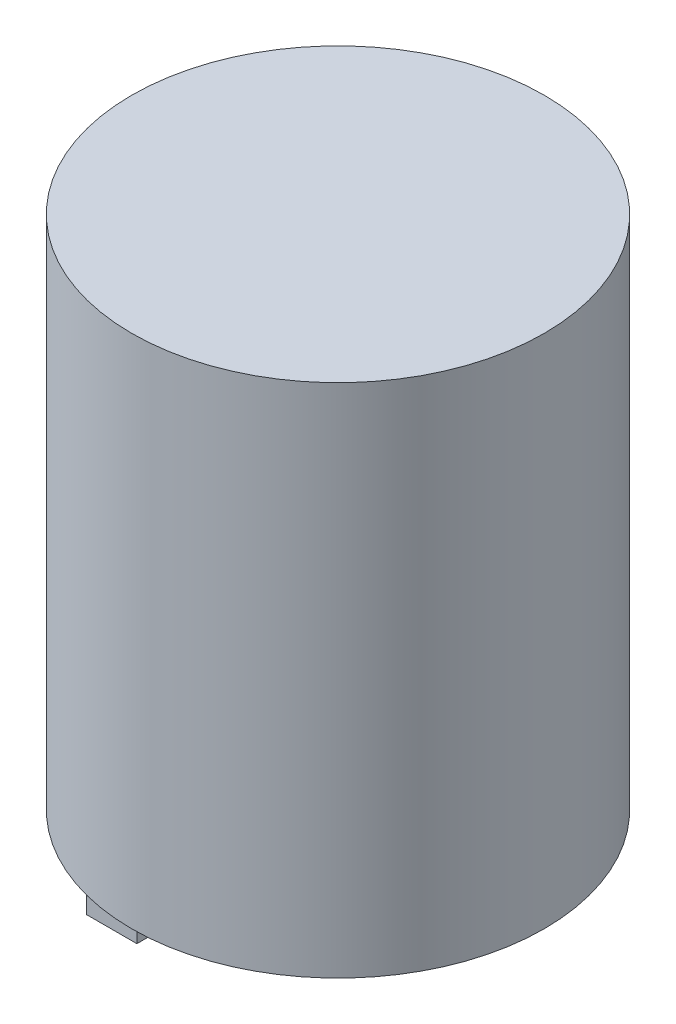
ISO-10303-21;
HEADER;
FILE_DESCRIPTION(('STEP AP214'),'2;1');
FILE_NAME('part.step','',(''),(''),'','','');
FILE_SCHEMA(('AUTOMOTIVE_DESIGN { 1 0 10303 214 1 1 1 1 }'));
ENDSEC;
DATA;
#1=APPLICATION_CONTEXT('core data for automotive mechanical design processes');
#2=APPLICATION_PROTOCOL_DEFINITION('international standard','automotive_design',2000,#1);
#3=PRODUCT_CONTEXT('',#1,'mechanical');
#4=PRODUCT('Part','Part','',(#3));
#5=PRODUCT_RELATED_PRODUCT_CATEGORY('part','',(#4));
#6=PRODUCT_DEFINITION_FORMATION('','',#4);
#7=PRODUCT_DEFINITION_CONTEXT('part definition',#1,'design');
#8=PRODUCT_DEFINITION('design','',#6,#7);
#9=PRODUCT_DEFINITION_SHAPE('','',#8);
#10=(LENGTH_UNIT() NAMED_UNIT(*) SI_UNIT(.MILLI.,.METRE.));
#11=(NAMED_UNIT(*) PLANE_ANGLE_UNIT() SI_UNIT($,.RADIAN.));
#12=(NAMED_UNIT(*) SI_UNIT($,.STERADIAN.) SOLID_ANGLE_UNIT());
#13=UNCERTAINTY_MEASURE_WITH_UNIT(LENGTH_MEASURE(1.E-05),#10,'distance_accuracy_value','');
#14=(GEOMETRIC_REPRESENTATION_CONTEXT(3) GLOBAL_UNCERTAINTY_ASSIGNED_CONTEXT((#13)) GLOBAL_UNIT_ASSIGNED_CONTEXT((#10,
#11,#12)) REPRESENTATION_CONTEXT('',''));
#15=CARTESIAN_POINT('',(0.,0.,0.));
#16=DIRECTION('',(0.,0.,1.));
#17=DIRECTION('',(1.,0.,0.));
#18=AXIS2_PLACEMENT_3D('',#15,#16,#17);
#19=CARTESIAN_POINT('',(-8.5,-8.,-2.5));
#20=DIRECTION('',(1.,0.,0.));
#21=DIRECTION('',(0.,0.,-1.));
#22=AXIS2_PLACEMENT_3D('',#19,#20,#21);
#23=PLANE('',#22);
#24=DIRECTION('',(0.,-1.,0.));
#25=VECTOR('',#24,1.);
#26=CARTESIAN_POINT('',(-8.5,-8.,1.5));
#27=LINE('',#26,#25);
#28=CARTESIAN_POINT('',(-8.5,-0.75,1.5));
#29=VERTEX_POINT('',#28);
#30=CARTESIAN_POINT('',(-8.5,-8.,1.5));
#31=VERTEX_POINT('',#30);
#32=EDGE_CURVE('E58',#29,#31,#27,.T.);
#33=ORIENTED_EDGE('',*,*,#32,.F.);
#34=DIRECTION('',(0.,0.,1.));
#35=VECTOR('',#34,1.);
#36=CARTESIAN_POINT('',(-8.5,-0.75,1.5));
#37=LINE('',#36,#35);
#38=CARTESIAN_POINT('',(-8.5,-0.75,-1.5));
#39=VERTEX_POINT('',#38);
#40=EDGE_CURVE('E171',#39,#29,#37,.T.);
#41=ORIENTED_EDGE('',*,*,#40,.F.);
#42=DIRECTION('',(0.,1.,0.));
#43=VECTOR('',#42,1.);
#44=CARTESIAN_POINT('',(-8.5,-0.75,-1.5));
#45=LINE('',#44,#43);
#46=CARTESIAN_POINT('',(-8.5,-8.,-1.5));
#47=VERTEX_POINT('',#46);
#48=EDGE_CURVE('E63',#47,#39,#45,.T.);
#49=ORIENTED_EDGE('',*,*,#48,.F.);
#50=DIRECTION('',(0.,0.,-1.));
#51=VECTOR('',#50,1.);
#52=CARTESIAN_POINT('',(-8.5,-8.,-2.5));
#53=LINE('',#52,#51);
#54=EDGE_CURVE('E129',#31,#47,#53,.T.);
#55=ORIENTED_EDGE('',*,*,#54,.F.);
#56=EDGE_LOOP('',(#33,#41,#49,#55));
#57=FACE_BOUND('',#56,.T.);
#58=ADVANCED_FACE('F44',(#57),#23,.F.);
#59=CARTESIAN_POINT('',(-8.5,-8.,-2.5));
#60=DIRECTION('',(0.,0.,1.));
#61=DIRECTION('',(1.,0.,0.));
#62=AXIS2_PLACEMENT_3D('',#59,#60,#61);
#63=PLANE('',#62);
#64=DIRECTION('',(1.,0.,0.));
#65=VECTOR('',#64,1.);
#66=CARTESIAN_POINT('',(-8.5,0.,-2.5));
#67=LINE('',#66,#65);
#68=CARTESIAN_POINT('',(-9.7,0.,-2.5));
#69=VERTEX_POINT('',#68);
#70=CARTESIAN_POINT('',(-7.25,0.,-2.5));
#71=VERTEX_POINT('',#70);
#72=EDGE_CURVE('E130',#69,#71,#67,.T.);
#73=ORIENTED_EDGE('',*,*,#72,.T.);
#74=DIRECTION('',(0.,1.,0.));
#75=VECTOR('',#74,1.);
#76=CARTESIAN_POINT('',(-7.25,-8.,-2.5));
#77=LINE('',#76,#75);
#78=CARTESIAN_POINT('',(-7.25,-8.,-2.5));
#79=VERTEX_POINT('',#78);
#80=EDGE_CURVE('E12',#79,#71,#77,.T.);
#81=ORIENTED_EDGE('',*,*,#80,.F.);
#82=DIRECTION('',(1.,0.,0.));
#83=VECTOR('',#82,1.);
#84=CARTESIAN_POINT('',(-8.5,-8.,-2.5));
#85=LINE('',#84,#83);
#86=CARTESIAN_POINT('',(-9.7,-8.,-2.5));
#87=VERTEX_POINT('',#86);
#88=EDGE_CURVE('E139',#87,#79,#85,.T.);
#89=ORIENTED_EDGE('',*,*,#88,.F.);
#90=DIRECTION('',(0.,-1.,0.));
#91=VECTOR('',#90,1.);
#92=CARTESIAN_POINT('',(-9.7,-8.,-2.5));
#93=LINE('',#92,#91);
#94=EDGE_CURVE('E124',#69,#87,#93,.T.);
#95=ORIENTED_EDGE('',*,*,#94,.F.);
#96=EDGE_LOOP('',(#73,#81,#89,#95));
#97=FACE_BOUND('',#96,.T.);
#98=ADVANCED_FACE('F184',(#97),#63,.F.);
#99=CARTESIAN_POINT('',(-7.25,-8.,-2.5));
#100=DIRECTION('',(-1.,0.,0.));
#101=DIRECTION('',(0.,0.,1.));
#102=AXIS2_PLACEMENT_3D('',#99,#100,#101);
#103=PLANE('',#102);
#104=DIRECTION('',(0.,0.,1.));
#105=VECTOR('',#104,1.);
#106=CARTESIAN_POINT('',(-7.25,0.,-2.5));
#107=LINE('',#106,#105);
#108=CARTESIAN_POINT('',(-7.25,0.,2.5));
#109=VERTEX_POINT('',#108);
#110=EDGE_CURVE('E132',#71,#109,#107,.T.);
#111=ORIENTED_EDGE('',*,*,#110,.T.);
#112=DIRECTION('',(0.,1.,0.));
#113=VECTOR('',#112,1.);
#114=CARTESIAN_POINT('',(-7.25,-8.,2.5));
#115=LINE('',#114,#113);
#116=CARTESIAN_POINT('',(-7.25,-8.,2.5));
#117=VERTEX_POINT('',#116);
#118=EDGE_CURVE('E51',#117,#109,#115,.T.);
#119=ORIENTED_EDGE('',*,*,#118,.F.);
#120=DIRECTION('',(0.,0.,1.));
#121=VECTOR('',#120,1.);
#122=CARTESIAN_POINT('',(-7.25,-8.,-2.5));
#123=LINE('',#122,#121);
#124=EDGE_CURVE('E142',#79,#117,#123,.T.);
#125=ORIENTED_EDGE('',*,*,#124,.F.);
#126=ORIENTED_EDGE('',*,*,#80,.T.);
#127=EDGE_LOOP('',(#111,#119,#125,#126));
#128=FACE_BOUND('',#127,.T.);
#129=ADVANCED_FACE('F188',(#128),#103,.F.);
#130=CARTESIAN_POINT('',(-8.5,-8.,2.5));
#131=DIRECTION('',(0.,0.,-1.));
#132=DIRECTION('',(-1.,0.,0.));
#133=AXIS2_PLACEMENT_3D('',#130,#131,#132);
#134=PLANE('',#133);
#135=DIRECTION('',(-1.,0.,0.));
#136=VECTOR('',#135,1.);
#137=CARTESIAN_POINT('',(-8.5,0.,2.5));
#138=LINE('',#137,#136);
#139=CARTESIAN_POINT('',(-9.7,0.,2.5));
#140=VERTEX_POINT('',#139);
#141=EDGE_CURVE('E140',#109,#140,#138,.T.);
#142=ORIENTED_EDGE('',*,*,#141,.T.);
#143=DIRECTION('',(0.,1.,0.));
#144=VECTOR('',#143,1.);
#145=CARTESIAN_POINT('',(-9.7,0.,2.5));
#146=LINE('',#145,#144);
#147=CARTESIAN_POINT('',(-9.7,-8.,2.5));
#148=VERTEX_POINT('',#147);
#149=EDGE_CURVE('E162',#148,#140,#146,.T.);
#150=ORIENTED_EDGE('',*,*,#149,.F.);
#151=DIRECTION('',(-1.,0.,0.));
#152=VECTOR('',#151,1.);
#153=CARTESIAN_POINT('',(-8.5,-8.,2.5));
#154=LINE('',#153,#152);
#155=EDGE_CURVE('E144',#117,#148,#154,.T.);
#156=ORIENTED_EDGE('',*,*,#155,.F.);
#157=ORIENTED_EDGE('',*,*,#118,.T.);
#158=EDGE_LOOP('',(#142,#150,#156,#157));
#159=FACE_BOUND('',#158,.T.);
#160=ADVANCED_FACE('F152',(#159),#134,.F.);
#161=CARTESIAN_POINT('',(0.,-8.,0.));
#162=DIRECTION('',(0.,1.,0.));
#163=DIRECTION('',(0.,0.,1.));
#164=AXIS2_PLACEMENT_3D('',#161,#162,#163);
#165=PLANE('',#164);
#166=ORIENTED_EDGE('',*,*,#155,.T.);
#167=DIRECTION('',(0.,0.,1.));
#168=VECTOR('',#167,1.);
#169=CARTESIAN_POINT('',(-9.7,-8.,2.5));
#170=LINE('',#169,#168);
#171=CARTESIAN_POINT('',(-9.7,-8.,1.5));
#172=VERTEX_POINT('',#171);
#173=EDGE_CURVE('E166',#172,#148,#170,.T.);
#174=ORIENTED_EDGE('',*,*,#173,.F.);
#175=DIRECTION('',(1.,0.,0.));
#176=VECTOR('',#175,1.);
#177=CARTESIAN_POINT('',(-9.7,-8.,1.5));
#178=LINE('',#177,#176);
#179=EDGE_CURVE('E164',#172,#31,#178,.T.);
#180=ORIENTED_EDGE('',*,*,#179,.T.);
#181=ORIENTED_EDGE('',*,*,#54,.T.);
#182=DIRECTION('',(1.,0.,0.));
#183=VECTOR('',#182,1.);
#184=CARTESIAN_POINT('',(-9.7,-8.,-1.5));
#185=LINE('',#184,#183);
#186=CARTESIAN_POINT('',(-9.7,-8.,-1.5));
#187=VERTEX_POINT('',#186);
#188=EDGE_CURVE('E111',#187,#47,#185,.T.);
#189=ORIENTED_EDGE('',*,*,#188,.F.);
#190=DIRECTION('',(0.,0.,1.));
#191=VECTOR('',#190,1.);
#192=CARTESIAN_POINT('',(-9.7,-8.,-1.5));
#193=LINE('',#192,#191);
#194=EDGE_CURVE('E117',#87,#187,#193,.T.);
#195=ORIENTED_EDGE('',*,*,#194,.F.);
#196=ORIENTED_EDGE('',*,*,#88,.T.);
#197=ORIENTED_EDGE('',*,*,#124,.T.);
#198=EDGE_LOOP('',(#166,#174,#180,#181,#189,#195,#196,#197));
#199=FACE_BOUND('',#198,.T.);
#200=ADVANCED_FACE('F127',(#199),#165,.F.);
#201=CARTESIAN_POINT('',(0.,0.,0.));
#202=DIRECTION('',(0.,1.,0.));
#203=DIRECTION('',(0.,0.,1.));
#204=AXIS2_PLACEMENT_3D('',#201,#202,#203);
#205=PLANE('',#204);
#206=ORIENTED_EDGE('',*,*,#72,.F.);
#207=DIRECTION('',(0.,0.,-1.));
#208=VECTOR('',#207,1.);
#209=CARTESIAN_POINT('',(-9.7,0.,-2.5));
#210=LINE('',#209,#208);
#211=EDGE_CURVE('E161',#140,#69,#210,.T.);
#212=ORIENTED_EDGE('',*,*,#211,.F.);
#213=ORIENTED_EDGE('',*,*,#141,.F.);
#214=ORIENTED_EDGE('',*,*,#110,.F.);
#215=EDGE_LOOP('',(#206,#212,#213,#214));
#216=FACE_BOUND('',#215,.T.);
#217=ADVANCED_FACE('F160',(#216),#205,.T.);
#218=CARTESIAN_POINT('',(-9.7,-0.75,-1.5));
#219=DIRECTION('',(0.,0.,-1.));
#220=DIRECTION('',(0.,1.,0.));
#221=AXIS2_PLACEMENT_3D('',#218,#219,#220);
#222=PLANE('',#221);
#223=ORIENTED_EDGE('',*,*,#48,.T.);
#224=DIRECTION('',(1.,0.,0.));
#225=VECTOR('',#224,1.);
#226=CARTESIAN_POINT('',(-9.7,-0.75,-1.5));
#227=LINE('',#226,#225);
#228=CARTESIAN_POINT('',(-9.7,-0.75,-1.5));
#229=VERTEX_POINT('',#228);
#230=EDGE_CURVE('E113',#229,#39,#227,.T.);
#231=ORIENTED_EDGE('',*,*,#230,.F.);
#232=DIRECTION('',(0.,1.,0.));
#233=VECTOR('',#232,1.);
#234=CARTESIAN_POINT('',(-9.7,-0.75,-1.5));
#235=LINE('',#234,#233);
#236=EDGE_CURVE('E107',#187,#229,#235,.T.);
#237=ORIENTED_EDGE('',*,*,#236,.F.);
#238=ORIENTED_EDGE('',*,*,#188,.T.);
#239=EDGE_LOOP('',(#223,#231,#237,#238));
#240=FACE_BOUND('',#239,.T.);
#241=ADVANCED_FACE('F109',(#240),#222,.F.);
#242=CARTESIAN_POINT('',(-9.7,-0.75,1.5));
#243=DIRECTION('',(0.,1.,0.));
#244=DIRECTION('',(0.,0.,1.));
#245=AXIS2_PLACEMENT_3D('',#242,#243,#244);
#246=PLANE('',#245);
#247=ORIENTED_EDGE('',*,*,#40,.T.);
#248=DIRECTION('',(1.,0.,0.));
#249=VECTOR('',#248,1.);
#250=CARTESIAN_POINT('',(-9.7,-0.75,1.5));
#251=LINE('',#250,#249);
#252=CARTESIAN_POINT('',(-9.7,-0.75,1.5));
#253=VERTEX_POINT('',#252);
#254=EDGE_CURVE('E134',#253,#29,#251,.T.);
#255=ORIENTED_EDGE('',*,*,#254,.F.);
#256=DIRECTION('',(0.,0.,1.));
#257=VECTOR('',#256,1.);
#258=CARTESIAN_POINT('',(-9.7,-0.75,1.5));
#259=LINE('',#258,#257);
#260=EDGE_CURVE('E116',#229,#253,#259,.T.);
#261=ORIENTED_EDGE('',*,*,#260,.F.);
#262=ORIENTED_EDGE('',*,*,#230,.T.);
#263=EDGE_LOOP('',(#247,#255,#261,#262));
#264=FACE_BOUND('',#263,.T.);
#265=ADVANCED_FACE('F182',(#264),#246,.F.);
#266=CARTESIAN_POINT('',(-9.7,-8.,1.5));
#267=DIRECTION('',(0.,0.,1.));
#268=DIRECTION('',(1.,0.,0.));
#269=AXIS2_PLACEMENT_3D('',#266,#267,#268);
#270=PLANE('',#269);
#271=ORIENTED_EDGE('',*,*,#32,.T.);
#272=ORIENTED_EDGE('',*,*,#179,.F.);
#273=DIRECTION('',(0.,-1.,0.));
#274=VECTOR('',#273,1.);
#275=CARTESIAN_POINT('',(-9.7,-8.,1.5));
#276=LINE('',#275,#274);
#277=EDGE_CURVE('E180',#253,#172,#276,.T.);
#278=ORIENTED_EDGE('',*,*,#277,.F.);
#279=ORIENTED_EDGE('',*,*,#254,.T.);
#280=EDGE_LOOP('',(#271,#272,#278,#279));
#281=FACE_BOUND('',#280,.T.);
#282=ADVANCED_FACE('F178',(#281),#270,.F.);
#283=CARTESIAN_POINT('',(-9.7,0.,0.));
#284=DIRECTION('',(1.,0.,0.));
#285=DIRECTION('',(0.,0.,-1.));
#286=AXIS2_PLACEMENT_3D('',#283,#284,#285);
#287=PLANE('',#286);
#288=ORIENTED_EDGE('',*,*,#194,.T.);
#289=ORIENTED_EDGE('',*,*,#236,.T.);
#290=ORIENTED_EDGE('',*,*,#260,.T.);
#291=ORIENTED_EDGE('',*,*,#277,.T.);
#292=ORIENTED_EDGE('',*,*,#173,.T.);
#293=ORIENTED_EDGE('',*,*,#149,.T.);
#294=ORIENTED_EDGE('',*,*,#211,.T.);
#295=ORIENTED_EDGE('',*,*,#94,.T.);
#296=EDGE_LOOP('',(#288,#289,#290,#291,#292,#293,#294,#295));
#297=FACE_BOUND('',#296,.T.);
#298=ADVANCED_FACE('F121',(#297),#287,.F.);
#299=CLOSED_SHELL('',(#58,#98,#129,#160,#200,#217,#241,#265,#282,#298));
#300=MANIFOLD_SOLID_BREP('B2',#299);
#301=CARTESIAN_POINT('',(0.,25.,0.));
#302=DIRECTION('',(0.,-1.,0.));
#303=DIRECTION('',(0.,0.,-1.));
#304=AXIS2_PLACEMENT_3D('',#301,#302,#303);
#305=CYLINDRICAL_SURFACE('',#304,10.);
#306=CARTESIAN_POINT('',(0.,25.,0.));
#307=DIRECTION('',(0.,1.,0.));
#308=DIRECTION('',(0.,0.,1.));
#309=AXIS2_PLACEMENT_3D('',#306,#307,#308);
#310=CIRCLE('',#309,10.);
#311=CARTESIAN_POINT('',(0.,25.,10.));
#312=VERTEX_POINT('',#311);
#313=EDGE_CURVE('E43',#312,#312,#310,.T.);
#314=ORIENTED_EDGE('',*,*,#313,.F.);
#315=EDGE_LOOP('',(#314));
#316=FACE_BOUND('',#315,.T.);
#317=CARTESIAN_POINT('',(0.,0.,0.));
#318=DIRECTION('',(0.,1.,0.));
#319=DIRECTION('',(0.,0.,1.));
#320=AXIS2_PLACEMENT_3D('',#317,#318,#319);
#321=CIRCLE('',#320,10.);
#322=CARTESIAN_POINT('',(0.,0.,10.));
#323=VERTEX_POINT('',#322);
#324=EDGE_CURVE('E289',#323,#323,#321,.T.);
#325=ORIENTED_EDGE('',*,*,#324,.T.);
#326=EDGE_LOOP('',(#325));
#327=FACE_BOUND('',#326,.T.);
#328=ADVANCED_FACE('F286',(#316,#327),#305,.T.);
#329=CARTESIAN_POINT('',(0.,25.,0.));
#330=DIRECTION('',(0.,1.,0.));
#331=DIRECTION('',(0.,0.,1.));
#332=AXIS2_PLACEMENT_3D('',#329,#330,#331);
#333=PLANE('',#332);
#334=ORIENTED_EDGE('',*,*,#313,.T.);
#335=EDGE_LOOP('',(#334));
#336=FACE_BOUND('',#335,.T.);
#337=ADVANCED_FACE('F301',(#336),#333,.T.);
#338=CARTESIAN_POINT('',(0.,0.,0.));
#339=DIRECTION('',(0.,1.,0.));
#340=DIRECTION('',(0.,0.,1.));
#341=AXIS2_PLACEMENT_3D('',#338,#339,#340);
#342=PLANE('',#341);
#343=ORIENTED_EDGE('',*,*,#324,.F.);
#344=EDGE_LOOP('',(#343));
#345=FACE_BOUND('',#344,.T.);
#346=ADVANCED_FACE('F299',(#345),#342,.F.);
#347=CLOSED_SHELL('',(#328,#337,#346));
#348=MANIFOLD_SOLID_BREP('B6',#347);
#349=ADVANCED_BREP_SHAPE_REPRESENTATION('',(#18,#300,#348),#14);
#350=SHAPE_DEFINITION_REPRESENTATION(#9,#349);
ENDSEC;
END-ISO-10303-21;
